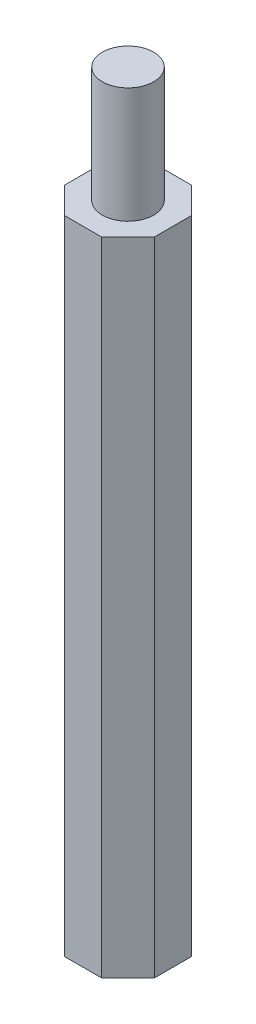
ISO-10303-21;
HEADER;
FILE_DESCRIPTION(('STEP AP214'),'2;1');
FILE_NAME('part.step','',(''),(''),'','','');
FILE_SCHEMA(('AUTOMOTIVE_DESIGN { 1 0 10303 214 1 1 1 1 }'));
ENDSEC;
DATA;
#1=APPLICATION_CONTEXT('core data for automotive mechanical design processes');
#2=APPLICATION_PROTOCOL_DEFINITION('international standard','automotive_design',2000,#1);
#3=PRODUCT_CONTEXT('',#1,'mechanical');
#4=PRODUCT('Part','Part','',(#3));
#5=PRODUCT_RELATED_PRODUCT_CATEGORY('part','',(#4));
#6=PRODUCT_DEFINITION_FORMATION('','',#4);
#7=PRODUCT_DEFINITION_CONTEXT('part definition',#1,'design');
#8=PRODUCT_DEFINITION('design','',#6,#7);
#9=PRODUCT_DEFINITION_SHAPE('','',#8);
#10=(LENGTH_UNIT() NAMED_UNIT(*) SI_UNIT(.MILLI.,.METRE.));
#11=(NAMED_UNIT(*) PLANE_ANGLE_UNIT() SI_UNIT($,.RADIAN.));
#12=(NAMED_UNIT(*) SI_UNIT($,.STERADIAN.) SOLID_ANGLE_UNIT());
#13=UNCERTAINTY_MEASURE_WITH_UNIT(LENGTH_MEASURE(1.E-05),#10,'distance_accuracy_value','');
#14=(GEOMETRIC_REPRESENTATION_CONTEXT(3) GLOBAL_UNCERTAINTY_ASSIGNED_CONTEXT((#13)) GLOBAL_UNIT_ASSIGNED_CONTEXT((#10,
#11,#12)) REPRESENTATION_CONTEXT('',''));
#15=CARTESIAN_POINT('',(0.,0.,0.));
#16=DIRECTION('',(0.,0.,1.));
#17=DIRECTION('',(1.,0.,0.));
#18=AXIS2_PLACEMENT_3D('',#15,#16,#17);
#19=CARTESIAN_POINT('',(-4.94974746830584,25.,0.));
#20=DIRECTION('',(0.,1.,0.));
#21=DIRECTION('',(0.,0.,1.));
#22=AXIS2_PLACEMENT_3D('',#19,#20,#21);
#23=PLANE('',#22);
#24=DIRECTION('',(-0.707106781186548,0.,0.707106781186546));
#25=VECTOR('',#24,1.);
#26=CARTESIAN_POINT('',(-3.5,25.,-1.44974746830583));
#27=LINE('',#26,#25);
#28=CARTESIAN_POINT('',(-1.44974746830583,25.,-3.5));
#29=VERTEX_POINT('',#28);
#30=CARTESIAN_POINT('',(-3.5,25.,-1.44974746830583));
#31=VERTEX_POINT('',#30);
#32=EDGE_CURVE('E143',#29,#31,#27,.T.);
#33=ORIENTED_EDGE('',*,*,#32,.T.);
#34=DIRECTION('',(0.,0.,1.));
#35=VECTOR('',#34,1.);
#36=CARTESIAN_POINT('',(-3.5,25.,1.44974746830583));
#37=LINE('',#36,#35);
#38=CARTESIAN_POINT('',(-3.5,25.,1.44974746830583));
#39=VERTEX_POINT('',#38);
#40=EDGE_CURVE('E91',#31,#39,#37,.T.);
#41=ORIENTED_EDGE('',*,*,#40,.T.);
#42=DIRECTION('',(0.707106781186548,0.,0.707106781186548));
#43=VECTOR('',#42,1.);
#44=CARTESIAN_POINT('',(-1.44974746830583,25.,3.5));
#45=LINE('',#44,#43);
#46=CARTESIAN_POINT('',(-1.44974746830583,25.,3.5));
#47=VERTEX_POINT('',#46);
#48=EDGE_CURVE('E158',#39,#47,#45,.T.);
#49=ORIENTED_EDGE('',*,*,#48,.T.);
#50=DIRECTION('',(1.,0.,0.));
#51=VECTOR('',#50,1.);
#52=CARTESIAN_POINT('',(1.44974746830583,25.,3.5));
#53=LINE('',#52,#51);
#54=CARTESIAN_POINT('',(1.44974746830583,25.,3.5));
#55=VERTEX_POINT('',#54);
#56=EDGE_CURVE('E170',#47,#55,#53,.T.);
#57=ORIENTED_EDGE('',*,*,#56,.T.);
#58=DIRECTION('',(0.707106781186548,0.,-0.707106781186547));
#59=VECTOR('',#58,1.);
#60=CARTESIAN_POINT('',(3.5,25.,1.44974746830583));
#61=LINE('',#60,#59);
#62=CARTESIAN_POINT('',(3.5,25.,1.44974746830583));
#63=VERTEX_POINT('',#62);
#64=EDGE_CURVE('E110',#55,#63,#61,.T.);
#65=ORIENTED_EDGE('',*,*,#64,.T.);
#66=DIRECTION('',(0.,0.,-1.));
#67=VECTOR('',#66,1.);
#68=CARTESIAN_POINT('',(3.5,25.,-1.44974746830583));
#69=LINE('',#68,#67);
#70=CARTESIAN_POINT('',(3.5,25.,-1.44974746830583));
#71=VERTEX_POINT('',#70);
#72=EDGE_CURVE('E104',#63,#71,#69,.T.);
#73=ORIENTED_EDGE('',*,*,#72,.T.);
#74=DIRECTION('',(-0.707106781186548,0.,-0.707106781186547));
#75=VECTOR('',#74,1.);
#76=CARTESIAN_POINT('',(1.44974746830583,25.,-3.5));
#77=LINE('',#76,#75);
#78=CARTESIAN_POINT('',(1.44974746830583,25.,-3.5));
#79=VERTEX_POINT('',#78);
#80=EDGE_CURVE('E108',#71,#79,#77,.T.);
#81=ORIENTED_EDGE('',*,*,#80,.T.);
#82=DIRECTION('',(-1.,0.,0.));
#83=VECTOR('',#82,1.);
#84=CARTESIAN_POINT('',(-1.44974746830583,25.,-3.5));
#85=LINE('',#84,#83);
#86=EDGE_CURVE('E48',#79,#29,#85,.T.);
#87=ORIENTED_EDGE('',*,*,#86,.T.);
#88=EDGE_LOOP('',(#33,#41,#49,#57,#65,#73,#81,#87));
#89=FACE_BOUND('',#88,.T.);
#90=CARTESIAN_POINT('',(0.,25.,0.));
#91=DIRECTION('',(0.,1.,0.));
#92=DIRECTION('',(0.,0.,1.));
#93=AXIS2_PLACEMENT_3D('',#90,#91,#92);
#94=CIRCLE('',#93,2.);
#95=CARTESIAN_POINT('',(0.,25.,2.));
#96=VERTEX_POINT('',#95);
#97=EDGE_CURVE('E176',#96,#96,#94,.T.);
#98=ORIENTED_EDGE('',*,*,#97,.F.);
#99=EDGE_LOOP('',(#98));
#100=FACE_BOUND('',#99,.T.);
#101=ADVANCED_FACE('F31',(#89,#100),#23,.T.);
#102=CARTESIAN_POINT('',(-3.5,25.,-1.44974746830583));
#103=DIRECTION('',(0.707106781186547,0.,0.707106781186548));
#104=DIRECTION('',(0.707106781186548,0.,-0.707106781186547));
#105=AXIS2_PLACEMENT_3D('',#102,#103,#104);
#106=PLANE('',#105);
#107=DIRECTION('',(-0.707106781186548,0.,0.707106781186546));
#108=VECTOR('',#107,1.);
#109=CARTESIAN_POINT('',(-3.5,-25.,-1.44974746830583));
#110=LINE('',#109,#108);
#111=CARTESIAN_POINT('',(-1.44974746830583,-25.,-3.5));
#112=VERTEX_POINT('',#111);
#113=CARTESIAN_POINT('',(-3.5,-25.,-1.44974746830583));
#114=VERTEX_POINT('',#113);
#115=EDGE_CURVE('E128',#112,#114,#110,.T.);
#116=ORIENTED_EDGE('',*,*,#115,.T.);
#117=DIRECTION('',(0.,-1.,0.));
#118=VECTOR('',#117,1.);
#119=CARTESIAN_POINT('',(-3.5,25.,-1.44974746830583));
#120=LINE('',#119,#118);
#121=EDGE_CURVE('E11',#31,#114,#120,.T.);
#122=ORIENTED_EDGE('',*,*,#121,.F.);
#123=ORIENTED_EDGE('',*,*,#32,.F.);
#124=DIRECTION('',(0.,-1.,0.));
#125=VECTOR('',#124,1.);
#126=CARTESIAN_POINT('',(-1.44974746830583,25.,-3.5));
#127=LINE('',#126,#125);
#128=EDGE_CURVE('E124',#29,#112,#127,.T.);
#129=ORIENTED_EDGE('',*,*,#128,.T.);
#130=EDGE_LOOP('',(#116,#122,#123,#129));
#131=FACE_BOUND('',#130,.T.);
#132=ADVANCED_FACE('F33',(#131),#106,.F.);
#133=CARTESIAN_POINT('',(-3.5,25.,1.44974746830583));
#134=DIRECTION('',(1.,0.,0.));
#135=DIRECTION('',(0.,0.,-1.));
#136=AXIS2_PLACEMENT_3D('',#133,#134,#135);
#137=PLANE('',#136);
#138=DIRECTION('',(0.,0.,1.));
#139=VECTOR('',#138,1.);
#140=CARTESIAN_POINT('',(-3.5,-25.,1.44974746830583));
#141=LINE('',#140,#139);
#142=CARTESIAN_POINT('',(-3.5,-25.,1.44974746830583));
#143=VERTEX_POINT('',#142);
#144=EDGE_CURVE('E131',#114,#143,#141,.T.);
#145=ORIENTED_EDGE('',*,*,#144,.T.);
#146=DIRECTION('',(0.,-1.,0.));
#147=VECTOR('',#146,1.);
#148=CARTESIAN_POINT('',(-3.5,25.,1.44974746830583));
#149=LINE('',#148,#147);
#150=EDGE_CURVE('E40',#39,#143,#149,.T.);
#151=ORIENTED_EDGE('',*,*,#150,.F.);
#152=ORIENTED_EDGE('',*,*,#40,.F.);
#153=ORIENTED_EDGE('',*,*,#121,.T.);
#154=EDGE_LOOP('',(#145,#151,#152,#153));
#155=FACE_BOUND('',#154,.T.);
#156=ADVANCED_FACE('F213',(#155),#137,.F.);
#157=CARTESIAN_POINT('',(-1.44974746830583,25.,3.5));
#158=DIRECTION('',(0.707106781186548,0.,-0.707106781186548));
#159=DIRECTION('',(-0.707106781186548,0.,-0.707106781186548));
#160=AXIS2_PLACEMENT_3D('',#157,#158,#159);
#161=PLANE('',#160);
#162=DIRECTION('',(0.707106781186548,0.,0.707106781186548));
#163=VECTOR('',#162,1.);
#164=CARTESIAN_POINT('',(-1.44974746830583,-25.,3.5));
#165=LINE('',#164,#163);
#166=CARTESIAN_POINT('',(-1.44974746830583,-25.,3.5));
#167=VERTEX_POINT('',#166);
#168=EDGE_CURVE('E134',#143,#167,#165,.T.);
#169=ORIENTED_EDGE('',*,*,#168,.T.);
#170=DIRECTION('',(0.,-1.,0.));
#171=VECTOR('',#170,1.);
#172=CARTESIAN_POINT('',(-1.44974746830583,25.,3.5));
#173=LINE('',#172,#171);
#174=EDGE_CURVE('E150',#47,#167,#173,.T.);
#175=ORIENTED_EDGE('',*,*,#174,.F.);
#176=ORIENTED_EDGE('',*,*,#48,.F.);
#177=ORIENTED_EDGE('',*,*,#150,.T.);
#178=EDGE_LOOP('',(#169,#175,#176,#177));
#179=FACE_BOUND('',#178,.T.);
#180=ADVANCED_FACE('F156',(#179),#161,.F.);
#181=CARTESIAN_POINT('',(1.44974746830583,25.,3.5));
#182=DIRECTION('',(0.,0.,-1.));
#183=DIRECTION('',(-1.,0.,0.));
#184=AXIS2_PLACEMENT_3D('',#181,#182,#183);
#185=PLANE('',#184);
#186=DIRECTION('',(1.,0.,0.));
#187=VECTOR('',#186,1.);
#188=CARTESIAN_POINT('',(1.44974746830583,-25.,3.5));
#189=LINE('',#188,#187);
#190=CARTESIAN_POINT('',(1.44974746830583,-25.,3.5));
#191=VERTEX_POINT('',#190);
#192=EDGE_CURVE('E136',#167,#191,#189,.T.);
#193=ORIENTED_EDGE('',*,*,#192,.T.);
#194=DIRECTION('',(0.,-1.,0.));
#195=VECTOR('',#194,1.);
#196=CARTESIAN_POINT('',(1.44974746830583,25.,3.5));
#197=LINE('',#196,#195);
#198=EDGE_CURVE('E147',#55,#191,#197,.T.);
#199=ORIENTED_EDGE('',*,*,#198,.F.);
#200=ORIENTED_EDGE('',*,*,#56,.F.);
#201=ORIENTED_EDGE('',*,*,#174,.T.);
#202=EDGE_LOOP('',(#193,#199,#200,#201));
#203=FACE_BOUND('',#202,.T.);
#204=ADVANCED_FACE('F166',(#203),#185,.F.);
#205=CARTESIAN_POINT('',(3.5,25.,1.44974746830583));
#206=DIRECTION('',(-0.707106781186547,0.,-0.707106781186548));
#207=DIRECTION('',(-0.707106781186548,0.,0.707106781186547));
#208=AXIS2_PLACEMENT_3D('',#205,#206,#207);
#209=PLANE('',#208);
#210=DIRECTION('',(0.707106781186548,0.,-0.707106781186547));
#211=VECTOR('',#210,1.);
#212=CARTESIAN_POINT('',(3.5,-25.,1.44974746830583));
#213=LINE('',#212,#211);
#214=CARTESIAN_POINT('',(3.5,-25.,1.44974746830583));
#215=VERTEX_POINT('',#214);
#216=EDGE_CURVE('E138',#191,#215,#213,.T.);
#217=ORIENTED_EDGE('',*,*,#216,.T.);
#218=DIRECTION('',(0.,-1.,0.));
#219=VECTOR('',#218,1.);
#220=CARTESIAN_POINT('',(3.5,25.,1.44974746830583));
#221=LINE('',#220,#219);
#222=EDGE_CURVE('E119',#63,#215,#221,.T.);
#223=ORIENTED_EDGE('',*,*,#222,.F.);
#224=ORIENTED_EDGE('',*,*,#64,.F.);
#225=ORIENTED_EDGE('',*,*,#198,.T.);
#226=EDGE_LOOP('',(#217,#223,#224,#225));
#227=FACE_BOUND('',#226,.T.);
#228=ADVANCED_FACE('F169',(#227),#209,.F.);
#229=CARTESIAN_POINT('',(3.5,25.,-1.44974746830583));
#230=DIRECTION('',(-1.,0.,0.));
#231=DIRECTION('',(0.,0.,1.));
#232=AXIS2_PLACEMENT_3D('',#229,#230,#231);
#233=PLANE('',#232);
#234=DIRECTION('',(0.,0.,-1.));
#235=VECTOR('',#234,1.);
#236=CARTESIAN_POINT('',(3.5,-25.,-1.44974746830583));
#237=LINE('',#236,#235);
#238=CARTESIAN_POINT('',(3.5,-25.,-1.44974746830583));
#239=VERTEX_POINT('',#238);
#240=EDGE_CURVE('E118',#215,#239,#237,.T.);
#241=ORIENTED_EDGE('',*,*,#240,.T.);
#242=DIRECTION('',(0.,-1.,0.));
#243=VECTOR('',#242,1.);
#244=CARTESIAN_POINT('',(3.5,25.,-1.44974746830583));
#245=LINE('',#244,#243);
#246=EDGE_CURVE('E115',#71,#239,#245,.T.);
#247=ORIENTED_EDGE('',*,*,#246,.F.);
#248=ORIENTED_EDGE('',*,*,#72,.F.);
#249=ORIENTED_EDGE('',*,*,#222,.T.);
#250=EDGE_LOOP('',(#241,#247,#248,#249));
#251=FACE_BOUND('',#250,.T.);
#252=ADVANCED_FACE('F116',(#251),#233,.F.);
#253=CARTESIAN_POINT('',(1.44974746830583,25.,-3.5));
#254=DIRECTION('',(-0.707106781186547,0.,0.707106781186548));
#255=DIRECTION('',(0.707106781186548,0.,0.707106781186547));
#256=AXIS2_PLACEMENT_3D('',#253,#254,#255);
#257=PLANE('',#256);
#258=DIRECTION('',(-0.707106781186548,0.,-0.707106781186547));
#259=VECTOR('',#258,1.);
#260=CARTESIAN_POINT('',(1.44974746830583,-25.,-3.5));
#261=LINE('',#260,#259);
#262=CARTESIAN_POINT('',(1.44974746830583,-25.,-3.5));
#263=VERTEX_POINT('',#262);
#264=EDGE_CURVE('E77',#239,#263,#261,.T.);
#265=ORIENTED_EDGE('',*,*,#264,.T.);
#266=DIRECTION('',(0.,-1.,0.));
#267=VECTOR('',#266,1.);
#268=CARTESIAN_POINT('',(1.44974746830583,25.,-3.5));
#269=LINE('',#268,#267);
#270=EDGE_CURVE('E120',#79,#263,#269,.T.);
#271=ORIENTED_EDGE('',*,*,#270,.F.);
#272=ORIENTED_EDGE('',*,*,#80,.F.);
#273=ORIENTED_EDGE('',*,*,#246,.T.);
#274=EDGE_LOOP('',(#265,#271,#272,#273));
#275=FACE_BOUND('',#274,.T.);
#276=ADVANCED_FACE('F122',(#275),#257,.F.);
#277=CARTESIAN_POINT('',(-1.44974746830583,25.,-3.5));
#278=DIRECTION('',(0.,0.,1.));
#279=DIRECTION('',(1.,0.,0.));
#280=AXIS2_PLACEMENT_3D('',#277,#278,#279);
#281=PLANE('',#280);
#282=DIRECTION('',(-1.,0.,0.));
#283=VECTOR('',#282,1.);
#284=CARTESIAN_POINT('',(-1.44974746830583,-25.,-3.5));
#285=LINE('',#284,#283);
#286=EDGE_CURVE('E83',#263,#112,#285,.T.);
#287=ORIENTED_EDGE('',*,*,#286,.T.);
#288=ORIENTED_EDGE('',*,*,#128,.F.);
#289=ORIENTED_EDGE('',*,*,#86,.F.);
#290=ORIENTED_EDGE('',*,*,#270,.T.);
#291=EDGE_LOOP('',(#287,#288,#289,#290));
#292=FACE_BOUND('',#291,.T.);
#293=ADVANCED_FACE('F199',(#292),#281,.F.);
#294=CARTESIAN_POINT('',(-4.94974746830584,-25.,0.));
#295=DIRECTION('',(0.,1.,0.));
#296=DIRECTION('',(0.,0.,1.));
#297=AXIS2_PLACEMENT_3D('',#294,#295,#296);
#298=PLANE('',#297);
#299=CARTESIAN_POINT('',(0.,-25.,0.));
#300=DIRECTION('',(0.,-1.,0.));
#301=DIRECTION('',(0.,0.,-1.));
#302=AXIS2_PLACEMENT_3D('',#299,#300,#301);
#303=CIRCLE('',#302,2.);
#304=CARTESIAN_POINT('',(0.,-25.,-2.));
#305=VERTEX_POINT('',#304);
#306=EDGE_CURVE('E182',#305,#305,#303,.T.);
#307=ORIENTED_EDGE('',*,*,#306,.F.);
#308=EDGE_LOOP('',(#307));
#309=FACE_BOUND('',#308,.T.);
#310=ORIENTED_EDGE('',*,*,#115,.F.);
#311=ORIENTED_EDGE('',*,*,#286,.F.);
#312=ORIENTED_EDGE('',*,*,#264,.F.);
#313=ORIENTED_EDGE('',*,*,#240,.F.);
#314=ORIENTED_EDGE('',*,*,#216,.F.);
#315=ORIENTED_EDGE('',*,*,#192,.F.);
#316=ORIENTED_EDGE('',*,*,#168,.F.);
#317=ORIENTED_EDGE('',*,*,#144,.F.);
#318=EDGE_LOOP('',(#310,#311,#312,#313,#314,#315,#316,#317));
#319=FACE_BOUND('',#318,.T.);
#320=ADVANCED_FACE('F162',(#309,#319),#298,.F.);
#321=CARTESIAN_POINT('',(0.,34.,0.));
#322=DIRECTION('',(0.,-1.,0.));
#323=DIRECTION('',(0.,0.,-1.));
#324=AXIS2_PLACEMENT_3D('',#321,#322,#323);
#325=CYLINDRICAL_SURFACE('',#324,2.);
#326=CARTESIAN_POINT('',(0.,34.,0.));
#327=DIRECTION('',(0.,1.,0.));
#328=DIRECTION('',(0.,0.,1.));
#329=AXIS2_PLACEMENT_3D('',#326,#327,#328);
#330=CIRCLE('',#329,2.);
#331=CARTESIAN_POINT('',(0.,34.,2.));
#332=VERTEX_POINT('',#331);
#333=EDGE_CURVE('E132',#332,#332,#330,.T.);
#334=ORIENTED_EDGE('',*,*,#333,.F.);
#335=EDGE_LOOP('',(#334));
#336=FACE_BOUND('',#335,.T.);
#337=ORIENTED_EDGE('',*,*,#97,.T.);
#338=EDGE_LOOP('',(#337));
#339=FACE_BOUND('',#338,.T.);
#340=ADVANCED_FACE('F198',(#336,#339),#325,.T.);
#341=CARTESIAN_POINT('',(0.,34.,0.));
#342=DIRECTION('',(0.,1.,0.));
#343=DIRECTION('',(0.,0.,1.));
#344=AXIS2_PLACEMENT_3D('',#341,#342,#343);
#345=PLANE('',#344);
#346=ORIENTED_EDGE('',*,*,#333,.T.);
#347=EDGE_LOOP('',(#346));
#348=FACE_BOUND('',#347,.T.);
#349=ADVANCED_FACE('F193',(#348),#345,.T.);
#350=CARTESIAN_POINT('',(0.,-16.,0.));
#351=DIRECTION('',(0.,-1.,0.));
#352=DIRECTION('',(0.,0.,-1.));
#353=AXIS2_PLACEMENT_3D('',#350,#351,#352);
#354=CYLINDRICAL_SURFACE('',#353,2.);
#355=CARTESIAN_POINT('',(0.,-16.,0.));
#356=DIRECTION('',(0.,-1.,0.));
#357=DIRECTION('',(0.,0.,-1.));
#358=AXIS2_PLACEMENT_3D('',#355,#356,#357);
#359=CIRCLE('',#358,2.);
#360=CARTESIAN_POINT('',(0.,-16.,-2.));
#361=VERTEX_POINT('',#360);
#362=EDGE_CURVE('E179',#361,#361,#359,.T.);
#363=ORIENTED_EDGE('',*,*,#362,.F.);
#364=EDGE_LOOP('',(#363));
#365=FACE_BOUND('',#364,.T.);
#366=ORIENTED_EDGE('',*,*,#306,.T.);
#367=EDGE_LOOP('',(#366));
#368=FACE_BOUND('',#367,.T.);
#369=ADVANCED_FACE('F190',(#365,#368),#354,.F.);
#370=CARTESIAN_POINT('',(0.,-16.,0.));
#371=DIRECTION('',(0.,-1.,0.));
#372=DIRECTION('',(0.,0.,-1.));
#373=AXIS2_PLACEMENT_3D('',#370,#371,#372);
#374=PLANE('',#373);
#375=ORIENTED_EDGE('',*,*,#362,.T.);
#376=EDGE_LOOP('',(#375));
#377=FACE_BOUND('',#376,.T.);
#378=ADVANCED_FACE('F188',(#377),#374,.T.);
#379=CLOSED_SHELL('',(#101,#132,#156,#180,#204,#228,#252,#276,#293,#320,#340,#349,#369,#378));
#380=MANIFOLD_SOLID_BREP('B2',#379);
#381=ADVANCED_BREP_SHAPE_REPRESENTATION('',(#18,#380),#14);
#382=SHAPE_DEFINITION_REPRESENTATION(#9,#381);
ENDSEC;
END-ISO-10303-21;
